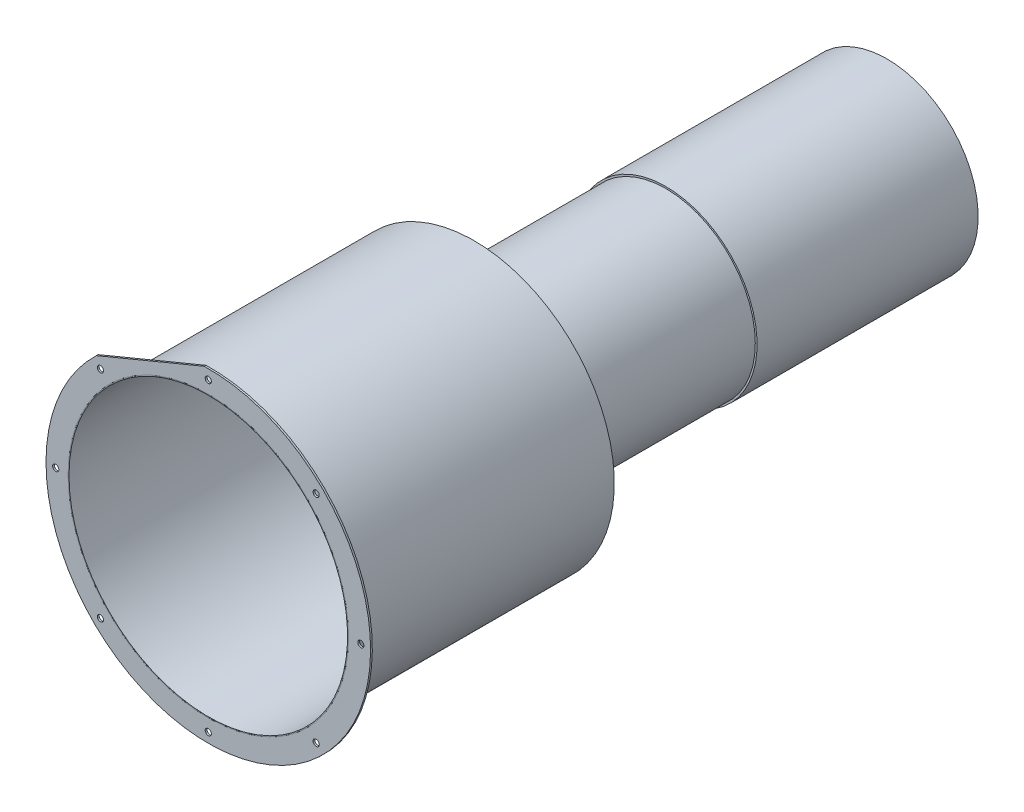
ISO-10303-21;
HEADER;
FILE_DESCRIPTION(('STEP AP214'),'2;1');
FILE_NAME('part.step','',(''),(''),'','','');
FILE_SCHEMA(('AUTOMOTIVE_DESIGN { 1 0 10303 214 1 1 1 1 }'));
ENDSEC;
DATA;
#1=APPLICATION_CONTEXT('core data for automotive mechanical design processes');
#2=APPLICATION_PROTOCOL_DEFINITION('international standard','automotive_design',2000,#1);
#3=PRODUCT_CONTEXT('',#1,'mechanical');
#4=PRODUCT('Part','Part','',(#3));
#5=PRODUCT_RELATED_PRODUCT_CATEGORY('part','',(#4));
#6=PRODUCT_DEFINITION_FORMATION('','',#4);
#7=PRODUCT_DEFINITION_CONTEXT('part definition',#1,'design');
#8=PRODUCT_DEFINITION('design','',#6,#7);
#9=PRODUCT_DEFINITION_SHAPE('','',#8);
#10=(LENGTH_UNIT() NAMED_UNIT(*) SI_UNIT(.MILLI.,.METRE.));
#11=(NAMED_UNIT(*) PLANE_ANGLE_UNIT() SI_UNIT($,.RADIAN.));
#12=(NAMED_UNIT(*) SI_UNIT($,.STERADIAN.) SOLID_ANGLE_UNIT());
#13=UNCERTAINTY_MEASURE_WITH_UNIT(LENGTH_MEASURE(1.E-05),#10,'distance_accuracy_value','');
#14=(GEOMETRIC_REPRESENTATION_CONTEXT(3) GLOBAL_UNCERTAINTY_ASSIGNED_CONTEXT((#13)) GLOBAL_UNIT_ASSIGNED_CONTEXT((#10,
#11,#12)) REPRESENTATION_CONTEXT('',''));
#15=CARTESIAN_POINT('',(0.,0.,0.));
#16=DIRECTION('',(0.,0.,1.));
#17=DIRECTION('',(1.,0.,0.));
#18=AXIS2_PLACEMENT_3D('',#15,#16,#17);
#19=CARTESIAN_POINT('',(0.,0.,765.5));
#20=DIRECTION('',(0.,0.,1.));
#21=DIRECTION('',(1.,0.,0.));
#22=AXIS2_PLACEMENT_3D('',#19,#20,#21);
#23=CYLINDRICAL_SURFACE('',#22,183.5);
#24=DIRECTION('',(0.,0.,-1.));
#25=VECTOR('',#24,1.);
#26=CARTESIAN_POINT('',(-4.53315254023774,183.443998342946,775.5));
#27=LINE('',#26,#25);
#28=CARTESIAN_POINT('',(-4.53315254023774,183.443998342946,767.5));
#29=VERTEX_POINT('',#28);
#30=CARTESIAN_POINT('',(-4.53315254023774,183.443998342946,765.5));
#31=VERTEX_POINT('',#30);
#32=EDGE_CURVE('E76',#29,#31,#27,.T.);
#33=ORIENTED_EDGE('',*,*,#32,.F.);
#34=CARTESIAN_POINT('',(0.,0.,767.5));
#35=DIRECTION('',(0.,0.,1.));
#36=DIRECTION('',(1.,0.,0.));
#37=AXIS2_PLACEMENT_3D('',#34,#35,#36);
#38=CIRCLE('',#37,183.5);
#39=CARTESIAN_POINT('',(-126.509072294917,132.919918097625,767.5));
#40=VERTEX_POINT('',#39);
#41=EDGE_CURVE('E89',#40,#29,#38,.T.);
#42=ORIENTED_EDGE('',*,*,#41,.F.);
#43=DIRECTION('',(0.,0.,-1.));
#44=VECTOR('',#43,1.);
#45=CARTESIAN_POINT('',(-126.509072294917,132.919918097625,775.5));
#46=LINE('',#45,#44);
#47=CARTESIAN_POINT('',(-126.509072294917,132.919918097625,765.5));
#48=VERTEX_POINT('',#47);
#49=EDGE_CURVE('E68',#40,#48,#46,.T.);
#50=ORIENTED_EDGE('',*,*,#49,.T.);
#51=CARTESIAN_POINT('',(0.,0.,765.5));
#52=DIRECTION('',(0.,0.,1.));
#53=DIRECTION('',(1.,0.,0.));
#54=AXIS2_PLACEMENT_3D('',#51,#52,#53);
#55=CIRCLE('',#54,183.5);
#56=EDGE_CURVE('E62',#48,#31,#55,.T.);
#57=ORIENTED_EDGE('',*,*,#56,.T.);
#58=EDGE_LOOP('',(#33,#42,#50,#57));
#59=FACE_BOUND('',#58,.T.);
#60=ADVANCED_FACE('F55',(#59),#23,.T.);
#61=CARTESIAN_POINT('',(0.,0.,765.5));
#62=DIRECTION('',(0.,0.,1.));
#63=DIRECTION('',(1.,0.,0.));
#64=AXIS2_PLACEMENT_3D('',#61,#62,#63);
#65=PLANE('',#64);
#66=CARTESIAN_POINT('',(121.975919754681,-121.975919754678,765.5));
#67=DIRECTION('',(0.,0.,1.));
#68=DIRECTION('',(0.707106781186556,-0.707106781186539,0.));
#69=AXIS2_PLACEMENT_3D('',#66,#67,#68);
#70=CIRCLE('',#69,3.49999999999999);
#71=CARTESIAN_POINT('',(124.450793488834,-124.450793488831,765.5));
#72=VERTEX_POINT('',#71);
#73=EDGE_CURVE('E138',#72,#72,#70,.T.);
#74=ORIENTED_EDGE('',*,*,#73,.T.);
#75=EDGE_LOOP('',(#74));
#76=FACE_BOUND('',#75,.T.);
#77=CARTESIAN_POINT('',(1.80684159285132E-12,-172.5,765.5));
#78=DIRECTION('',(0.,0.,1.));
#79=DIRECTION('',(0.,-1.,0.));
#80=AXIS2_PLACEMENT_3D('',#77,#78,#79);
#81=CIRCLE('',#80,3.49999999999999);
#82=CARTESIAN_POINT('',(1.84350214690917E-12,-176.,765.5));
#83=VERTEX_POINT('',#82);
#84=EDGE_CURVE('E132',#83,#83,#81,.T.);
#85=ORIENTED_EDGE('',*,*,#84,.T.);
#86=EDGE_LOOP('',(#85));
#87=FACE_BOUND('',#86,.T.);
#88=CARTESIAN_POINT('',(-121.975919754678,-121.975919754681,765.5));
#89=DIRECTION('',(0.,0.,1.));
#90=DIRECTION('',(-0.707106781186541,-0.707106781186554,0.));
#91=AXIS2_PLACEMENT_3D('',#88,#89,#90);
#92=CIRCLE('',#91,3.49999999999999);
#93=CARTESIAN_POINT('',(-124.450793488831,-124.450793488833,765.5));
#94=VERTEX_POINT('',#93);
#95=EDGE_CURVE('E126',#94,#94,#92,.T.);
#96=ORIENTED_EDGE('',*,*,#95,.T.);
#97=EDGE_LOOP('',(#96));
#98=FACE_BOUND('',#97,.T.);
#99=CARTESIAN_POINT('',(-172.5,0.,765.5));
#100=DIRECTION('',(0.,0.,1.));
#101=DIRECTION('',(-1.,0.,0.));
#102=AXIS2_PLACEMENT_3D('',#99,#100,#101);
#103=CIRCLE('',#102,3.49999999999999);
#104=CARTESIAN_POINT('',(-176.,0.,765.5));
#105=VERTEX_POINT('',#104);
#106=EDGE_CURVE('E120',#105,#105,#103,.T.);
#107=ORIENTED_EDGE('',*,*,#106,.T.);
#108=EDGE_LOOP('',(#107));
#109=FACE_BOUND('',#108,.T.);
#110=CARTESIAN_POINT('',(-121.97591975468,121.975919754679,765.5));
#111=DIRECTION('',(0.,0.,1.));
#112=DIRECTION('',(-0.707106781186551,0.707106781186544,0.));
#113=AXIS2_PLACEMENT_3D('',#110,#111,#112);
#114=CIRCLE('',#113,3.49999999999999);
#115=CARTESIAN_POINT('',(-124.450793488833,124.450793488832,765.5));
#116=VERTEX_POINT('',#115);
#117=EDGE_CURVE('E114',#116,#116,#114,.T.);
#118=ORIENTED_EDGE('',*,*,#117,.T.);
#119=EDGE_LOOP('',(#118));
#120=FACE_BOUND('',#119,.T.);
#121=CARTESIAN_POINT('',(-6.0228053095044E-13,172.5,765.5));
#122=DIRECTION('',(0.,0.,1.));
#123=DIRECTION('',(0.,1.,0.));
#124=AXIS2_PLACEMENT_3D('',#121,#122,#123);
#125=CIRCLE('',#124,3.49999999999999);
#126=CARTESIAN_POINT('',(-6.14500715636391E-13,176.,765.5));
#127=VERTEX_POINT('',#126);
#128=EDGE_CURVE('E108',#127,#127,#125,.T.);
#129=ORIENTED_EDGE('',*,*,#128,.T.);
#130=EDGE_LOOP('',(#129));
#131=FACE_BOUND('',#130,.T.);
#132=CARTESIAN_POINT('',(121.975919754679,121.97591975468,765.5));
#133=DIRECTION('',(0.,0.,1.));
#134=DIRECTION('',(0.707106781186546,0.707106781186549,0.));
#135=AXIS2_PLACEMENT_3D('',#132,#133,#134);
#136=CIRCLE('',#135,3.49999999999999);
#137=CARTESIAN_POINT('',(124.450793488832,124.450793488833,765.5));
#138=VERTEX_POINT('',#137);
#139=EDGE_CURVE('E102',#138,#138,#136,.T.);
#140=ORIENTED_EDGE('',*,*,#139,.T.);
#141=EDGE_LOOP('',(#140));
#142=FACE_BOUND('',#141,.T.);
#143=CARTESIAN_POINT('',(172.5,0.,765.5));
#144=DIRECTION('',(0.,0.,1.));
#145=DIRECTION('',(1.,0.,0.));
#146=AXIS2_PLACEMENT_3D('',#143,#144,#145);
#147=CIRCLE('',#146,3.49999999999999);
#148=CARTESIAN_POINT('',(176.,0.,765.5));
#149=VERTEX_POINT('',#148);
#150=EDGE_CURVE('E96',#149,#149,#147,.T.);
#151=ORIENTED_EDGE('',*,*,#150,.T.);
#152=EDGE_LOOP('',(#151));
#153=FACE_BOUND('',#152,.T.);
#154=CARTESIAN_POINT('',(0.,0.,765.5));
#155=DIRECTION('',(0.,0.,1.));
#156=DIRECTION('',(1.,0.,0.));
#157=AXIS2_PLACEMENT_3D('',#154,#155,#156);
#158=CIRCLE('',#157,158.5);
#159=CARTESIAN_POINT('',(158.5,0.,765.5));
#160=VERTEX_POINT('',#159);
#161=EDGE_CURVE('E91',#160,#160,#158,.T.);
#162=ORIENTED_EDGE('',*,*,#161,.T.);
#163=EDGE_LOOP('',(#162));
#164=FACE_BOUND('',#163,.T.);
#165=ORIENTED_EDGE('',*,*,#56,.F.);
#166=DIRECTION('',(-0.923879532511285,-0.382683432365094,0.));
#167=VECTOR('',#166,1.);
#168=CARTESIAN_POINT('',(-4.53315254023774,183.443998342946,765.5));
#169=LINE('',#168,#167);
#170=EDGE_CURVE('E79',#31,#48,#169,.T.);
#171=ORIENTED_EDGE('',*,*,#170,.F.);
#172=EDGE_LOOP('',(#165,#171));
#173=FACE_BOUND('',#172,.T.);
#174=ADVANCED_FACE('F87',(#76,#87,#98,#109,#120,#131,#142,#153,#164,#173),#65,.F.);
#175=CARTESIAN_POINT('',(0.,0.,767.5));
#176=DIRECTION('',(0.,0.,1.));
#177=DIRECTION('',(1.,0.,0.));
#178=AXIS2_PLACEMENT_3D('',#175,#176,#177);
#179=PLANE('',#178);
#180=DIRECTION('',(0.923879532511285,0.382683432365094,0.));
#181=VECTOR('',#180,1.);
#182=CARTESIAN_POINT('',(-65.5211124175775,158.181958220286,767.5));
#183=LINE('',#182,#181);
#184=EDGE_CURVE('E13',#40,#29,#183,.T.);
#185=ORIENTED_EDGE('',*,*,#184,.F.);
#186=ORIENTED_EDGE('',*,*,#41,.T.);
#187=EDGE_LOOP('',(#185,#186));
#188=FACE_BOUND('',#187,.T.);
#189=CARTESIAN_POINT('',(121.975919754681,-121.975919754678,767.5));
#190=DIRECTION('',(0.,0.,1.));
#191=DIRECTION('',(0.707106781186556,-0.707106781186539,0.));
#192=AXIS2_PLACEMENT_3D('',#189,#190,#191);
#193=CIRCLE('',#192,3.49999999999999);
#194=CARTESIAN_POINT('',(124.450793488834,-124.450793488831,767.5));
#195=VERTEX_POINT('',#194);
#196=EDGE_CURVE('E141',#195,#195,#193,.T.);
#197=ORIENTED_EDGE('',*,*,#196,.F.);
#198=EDGE_LOOP('',(#197));
#199=FACE_BOUND('',#198,.T.);
#200=CARTESIAN_POINT('',(1.80684159285132E-12,-172.5,767.5));
#201=DIRECTION('',(0.,0.,1.));
#202=DIRECTION('',(0.,-1.,0.));
#203=AXIS2_PLACEMENT_3D('',#200,#201,#202);
#204=CIRCLE('',#203,3.49999999999999);
#205=CARTESIAN_POINT('',(1.84350214690917E-12,-176.,767.5));
#206=VERTEX_POINT('',#205);
#207=EDGE_CURVE('E135',#206,#206,#204,.T.);
#208=ORIENTED_EDGE('',*,*,#207,.F.);
#209=EDGE_LOOP('',(#208));
#210=FACE_BOUND('',#209,.T.);
#211=CARTESIAN_POINT('',(-121.975919754678,-121.975919754681,767.5));
#212=DIRECTION('',(0.,0.,1.));
#213=DIRECTION('',(-0.707106781186541,-0.707106781186554,0.));
#214=AXIS2_PLACEMENT_3D('',#211,#212,#213);
#215=CIRCLE('',#214,3.49999999999999);
#216=CARTESIAN_POINT('',(-124.450793488831,-124.450793488833,767.5));
#217=VERTEX_POINT('',#216);
#218=EDGE_CURVE('E129',#217,#217,#215,.T.);
#219=ORIENTED_EDGE('',*,*,#218,.F.);
#220=EDGE_LOOP('',(#219));
#221=FACE_BOUND('',#220,.T.);
#222=CARTESIAN_POINT('',(-172.5,0.,767.5));
#223=DIRECTION('',(0.,0.,1.));
#224=DIRECTION('',(-1.,0.,0.));
#225=AXIS2_PLACEMENT_3D('',#222,#223,#224);
#226=CIRCLE('',#225,3.49999999999999);
#227=CARTESIAN_POINT('',(-176.,0.,767.5));
#228=VERTEX_POINT('',#227);
#229=EDGE_CURVE('E123',#228,#228,#226,.T.);
#230=ORIENTED_EDGE('',*,*,#229,.F.);
#231=EDGE_LOOP('',(#230));
#232=FACE_BOUND('',#231,.T.);
#233=CARTESIAN_POINT('',(-121.97591975468,121.975919754679,767.5));
#234=DIRECTION('',(0.,0.,1.));
#235=DIRECTION('',(-0.707106781186551,0.707106781186544,0.));
#236=AXIS2_PLACEMENT_3D('',#233,#234,#235);
#237=CIRCLE('',#236,3.49999999999999);
#238=CARTESIAN_POINT('',(-124.450793488833,124.450793488832,767.5));
#239=VERTEX_POINT('',#238);
#240=EDGE_CURVE('E117',#239,#239,#237,.T.);
#241=ORIENTED_EDGE('',*,*,#240,.F.);
#242=EDGE_LOOP('',(#241));
#243=FACE_BOUND('',#242,.T.);
#244=CARTESIAN_POINT('',(-6.0228053095044E-13,172.5,767.5));
#245=DIRECTION('',(0.,0.,1.));
#246=DIRECTION('',(0.,1.,0.));
#247=AXIS2_PLACEMENT_3D('',#244,#245,#246);
#248=CIRCLE('',#247,3.49999999999999);
#249=CARTESIAN_POINT('',(-6.14500715636391E-13,176.,767.5));
#250=VERTEX_POINT('',#249);
#251=EDGE_CURVE('E111',#250,#250,#248,.T.);
#252=ORIENTED_EDGE('',*,*,#251,.F.);
#253=EDGE_LOOP('',(#252));
#254=FACE_BOUND('',#253,.T.);
#255=CARTESIAN_POINT('',(121.975919754679,121.97591975468,767.5));
#256=DIRECTION('',(0.,0.,1.));
#257=DIRECTION('',(0.707106781186546,0.707106781186549,0.));
#258=AXIS2_PLACEMENT_3D('',#255,#256,#257);
#259=CIRCLE('',#258,3.49999999999999);
#260=CARTESIAN_POINT('',(124.450793488832,124.450793488833,767.5));
#261=VERTEX_POINT('',#260);
#262=EDGE_CURVE('E105',#261,#261,#259,.T.);
#263=ORIENTED_EDGE('',*,*,#262,.F.);
#264=EDGE_LOOP('',(#263));
#265=FACE_BOUND('',#264,.T.);
#266=CARTESIAN_POINT('',(172.5,0.,767.5));
#267=DIRECTION('',(0.,0.,1.));
#268=DIRECTION('',(1.,0.,0.));
#269=AXIS2_PLACEMENT_3D('',#266,#267,#268);
#270=CIRCLE('',#269,3.49999999999999);
#271=CARTESIAN_POINT('',(176.,0.,767.5));
#272=VERTEX_POINT('',#271);
#273=EDGE_CURVE('E99',#272,#272,#270,.T.);
#274=ORIENTED_EDGE('',*,*,#273,.F.);
#275=EDGE_LOOP('',(#274));
#276=FACE_BOUND('',#275,.T.);
#277=CARTESIAN_POINT('',(0.,0.,767.5));
#278=DIRECTION('',(0.,0.,1.));
#279=DIRECTION('',(1.,0.,0.));
#280=AXIS2_PLACEMENT_3D('',#277,#278,#279);
#281=CIRCLE('',#280,158.5);
#282=CARTESIAN_POINT('',(158.5,0.,767.5));
#283=VERTEX_POINT('',#282);
#284=EDGE_CURVE('E93',#283,#283,#281,.T.);
#285=ORIENTED_EDGE('',*,*,#284,.F.);
#286=EDGE_LOOP('',(#285));
#287=FACE_BOUND('',#286,.T.);
#288=ADVANCED_FACE('F157',(#188,#199,#210,#221,#232,#243,#254,#265,#276,#287),#179,.T.);
#289=CARTESIAN_POINT('',(0.,0.,765.5));
#290=DIRECTION('',(0.,0.,1.));
#291=DIRECTION('',(1.,0.,0.));
#292=AXIS2_PLACEMENT_3D('',#289,#290,#291);
#293=CYLINDRICAL_SURFACE('',#292,158.5);
#294=ORIENTED_EDGE('',*,*,#161,.F.);
#295=EDGE_LOOP('',(#294));
#296=FACE_BOUND('',#295,.T.);
#297=ORIENTED_EDGE('',*,*,#284,.T.);
#298=EDGE_LOOP('',(#297));
#299=FACE_BOUND('',#298,.T.);
#300=ADVANCED_FACE('F160',(#296,#299),#293,.F.);
#301=CARTESIAN_POINT('',(172.5,0.,765.5));
#302=DIRECTION('',(0.,0.,1.));
#303=DIRECTION('',(1.,0.,0.));
#304=AXIS2_PLACEMENT_3D('',#301,#302,#303);
#305=CYLINDRICAL_SURFACE('',#304,3.49999999999999);
#306=ORIENTED_EDGE('',*,*,#150,.F.);
#307=EDGE_LOOP('',(#306));
#308=FACE_BOUND('',#307,.T.);
#309=ORIENTED_EDGE('',*,*,#273,.T.);
#310=EDGE_LOOP('',(#309));
#311=FACE_BOUND('',#310,.T.);
#312=ADVANCED_FACE('F179',(#308,#311),#305,.F.);
#313=CARTESIAN_POINT('',(121.975919754679,121.97591975468,765.5));
#314=DIRECTION('',(0.,0.,1.));
#315=DIRECTION('',(1.,0.,0.));
#316=AXIS2_PLACEMENT_3D('',#313,#314,#315);
#317=CYLINDRICAL_SURFACE('',#316,3.49999999999999);
#318=ORIENTED_EDGE('',*,*,#139,.F.);
#319=EDGE_LOOP('',(#318));
#320=FACE_BOUND('',#319,.T.);
#321=ORIENTED_EDGE('',*,*,#262,.T.);
#322=EDGE_LOOP('',(#321));
#323=FACE_BOUND('',#322,.T.);
#324=ADVANCED_FACE('F186',(#320,#323),#317,.F.);
#325=CARTESIAN_POINT('',(-6.0228053095044E-13,172.5,765.5));
#326=DIRECTION('',(0.,0.,1.));
#327=DIRECTION('',(1.,0.,0.));
#328=AXIS2_PLACEMENT_3D('',#325,#326,#327);
#329=CYLINDRICAL_SURFACE('',#328,3.49999999999999);
#330=ORIENTED_EDGE('',*,*,#128,.F.);
#331=EDGE_LOOP('',(#330));
#332=FACE_BOUND('',#331,.T.);
#333=ORIENTED_EDGE('',*,*,#251,.T.);
#334=EDGE_LOOP('',(#333));
#335=FACE_BOUND('',#334,.T.);
#336=ADVANCED_FACE('F242',(#332,#335),#329,.F.);
#337=CARTESIAN_POINT('',(-121.97591975468,121.975919754679,765.5));
#338=DIRECTION('',(0.,0.,1.));
#339=DIRECTION('',(1.,0.,0.));
#340=AXIS2_PLACEMENT_3D('',#337,#338,#339);
#341=CYLINDRICAL_SURFACE('',#340,3.49999999999999);
#342=ORIENTED_EDGE('',*,*,#117,.F.);
#343=EDGE_LOOP('',(#342));
#344=FACE_BOUND('',#343,.T.);
#345=ORIENTED_EDGE('',*,*,#240,.T.);
#346=EDGE_LOOP('',(#345));
#347=FACE_BOUND('',#346,.T.);
#348=ADVANCED_FACE('F234',(#344,#347),#341,.F.);
#349=CARTESIAN_POINT('',(-172.5,0.,765.5));
#350=DIRECTION('',(0.,0.,1.));
#351=DIRECTION('',(1.,0.,0.));
#352=AXIS2_PLACEMENT_3D('',#349,#350,#351);
#353=CYLINDRICAL_SURFACE('',#352,3.49999999999999);
#354=ORIENTED_EDGE('',*,*,#106,.F.);
#355=EDGE_LOOP('',(#354));
#356=FACE_BOUND('',#355,.T.);
#357=ORIENTED_EDGE('',*,*,#229,.T.);
#358=EDGE_LOOP('',(#357));
#359=FACE_BOUND('',#358,.T.);
#360=ADVANCED_FACE('F226',(#356,#359),#353,.F.);
#361=CARTESIAN_POINT('',(-121.975919754678,-121.975919754681,765.5));
#362=DIRECTION('',(0.,0.,1.));
#363=DIRECTION('',(1.,0.,0.));
#364=AXIS2_PLACEMENT_3D('',#361,#362,#363);
#365=CYLINDRICAL_SURFACE('',#364,3.49999999999999);
#366=ORIENTED_EDGE('',*,*,#95,.F.);
#367=EDGE_LOOP('',(#366));
#368=FACE_BOUND('',#367,.T.);
#369=ORIENTED_EDGE('',*,*,#218,.T.);
#370=EDGE_LOOP('',(#369));
#371=FACE_BOUND('',#370,.T.);
#372=ADVANCED_FACE('F218',(#368,#371),#365,.F.);
#373=CARTESIAN_POINT('',(1.80684159285132E-12,-172.5,765.5));
#374=DIRECTION('',(0.,0.,1.));
#375=DIRECTION('',(1.,0.,0.));
#376=AXIS2_PLACEMENT_3D('',#373,#374,#375);
#377=CYLINDRICAL_SURFACE('',#376,3.49999999999999);
#378=ORIENTED_EDGE('',*,*,#84,.F.);
#379=EDGE_LOOP('',(#378));
#380=FACE_BOUND('',#379,.T.);
#381=ORIENTED_EDGE('',*,*,#207,.T.);
#382=EDGE_LOOP('',(#381));
#383=FACE_BOUND('',#382,.T.);
#384=ADVANCED_FACE('F153',(#380,#383),#377,.F.);
#385=CARTESIAN_POINT('',(121.975919754681,-121.975919754678,765.5));
#386=DIRECTION('',(0.,0.,1.));
#387=DIRECTION('',(1.,0.,0.));
#388=AXIS2_PLACEMENT_3D('',#385,#386,#387);
#389=CYLINDRICAL_SURFACE('',#388,3.49999999999999);
#390=ORIENTED_EDGE('',*,*,#73,.F.);
#391=EDGE_LOOP('',(#390));
#392=FACE_BOUND('',#391,.T.);
#393=ORIENTED_EDGE('',*,*,#196,.T.);
#394=EDGE_LOOP('',(#393));
#395=FACE_BOUND('',#394,.T.);
#396=ADVANCED_FACE('F150',(#392,#395),#389,.F.);
#397=CARTESIAN_POINT('',(-4.53315254023774,183.443998342946,775.5));
#398=DIRECTION('',(0.382683432365094,-0.923879532511285,0.));
#399=DIRECTION('',(0.923879532511285,0.382683432365094,0.));
#400=AXIS2_PLACEMENT_3D('',#397,#398,#399);
#401=PLANE('',#400);
#402=ORIENTED_EDGE('',*,*,#184,.T.);
#403=ORIENTED_EDGE('',*,*,#32,.T.);
#404=ORIENTED_EDGE('',*,*,#170,.T.);
#405=ORIENTED_EDGE('',*,*,#49,.F.);
#406=EDGE_LOOP('',(#402,#403,#404,#405));
#407=FACE_BOUND('',#406,.T.);
#408=ADVANCED_FACE('F78',(#407),#401,.F.);
#409=CLOSED_SHELL('',(#60,#174,#288,#300,#312,#324,#336,#348,#360,#372,#384,#396,#408));
#410=MANIFOLD_SOLID_BREP('B2',#409);
#411=CARTESIAN_POINT('',(0.,0.,0.));
#412=DIRECTION('',(0.,0.,-1.));
#413=DIRECTION('',(-1.,0.,0.));
#414=AXIS2_PLACEMENT_3D('',#411,#412,#413);
#415=CYLINDRICAL_SURFACE('',#414,101.);
#416=CARTESIAN_POINT('',(0.,0.,433.725009252407));
#417=DIRECTION('',(0.,0.,-1.));
#418=DIRECTION('',(-1.,0.,0.));
#419=AXIS2_PLACEMENT_3D('',#416,#417,#418);
#420=CIRCLE('',#419,101.);
#421=CARTESIAN_POINT('',(-101.,0.,433.725009252407));
#422=VERTEX_POINT('',#421);
#423=EDGE_CURVE('E347',#422,#422,#420,.T.);
#424=ORIENTED_EDGE('',*,*,#423,.T.);
#425=EDGE_LOOP('',(#424));
#426=FACE_BOUND('',#425,.T.);
#427=CARTESIAN_POINT('',(0.,0.,250.));
#428=DIRECTION('',(0.,0.,-1.));
#429=DIRECTION('',(-1.,0.,0.));
#430=AXIS2_PLACEMENT_3D('',#427,#428,#429);
#431=CIRCLE('',#430,101.);
#432=CARTESIAN_POINT('',(-101.,0.,250.));
#433=VERTEX_POINT('',#432);
#434=EDGE_CURVE('E54',#433,#433,#431,.T.);
#435=ORIENTED_EDGE('',*,*,#434,.F.);
#436=EDGE_LOOP('',(#435));
#437=FACE_BOUND('',#436,.T.);
#438=ADVANCED_FACE('F321',(#426,#437),#415,.T.);
#439=CARTESIAN_POINT('',(0.,0.,0.));
#440=DIRECTION('',(0.,0.,-1.));
#441=DIRECTION('',(-1.,0.,0.));
#442=AXIS2_PLACEMENT_3D('',#439,#440,#441);
#443=CYLINDRICAL_SURFACE('',#442,99.9999999999999);
#444=CARTESIAN_POINT('',(0.,0.,0.));
#445=DIRECTION('',(0.,0.,-1.));
#446=DIRECTION('',(-1.,0.,0.));
#447=AXIS2_PLACEMENT_3D('',#444,#445,#446);
#448=CIRCLE('',#447,99.9999999999999);
#449=CARTESIAN_POINT('',(-100.,0.,0.));
#450=VERTEX_POINT('',#449);
#451=EDGE_CURVE('E350',#450,#450,#448,.T.);
#452=ORIENTED_EDGE('',*,*,#451,.T.);
#453=EDGE_LOOP('',(#452));
#454=FACE_BOUND('',#453,.T.);
#455=CARTESIAN_POINT('',(0.,0.,434.302359521597));
#456=DIRECTION('',(0.,0.,-1.));
#457=DIRECTION('',(-1.,0.,0.));
#458=AXIS2_PLACEMENT_3D('',#455,#456,#457);
#459=CIRCLE('',#458,99.9999999999999);
#460=CARTESIAN_POINT('',(-100.,0.,434.302359521597));
#461=VERTEX_POINT('',#460);
#462=EDGE_CURVE('E328',#461,#461,#459,.T.);
#463=ORIENTED_EDGE('',*,*,#462,.F.);
#464=EDGE_LOOP('',(#463));
#465=FACE_BOUND('',#464,.T.);
#466=ADVANCED_FACE('F323',(#454,#465),#443,.F.);
#467=CARTESIAN_POINT('',(0.,0.,467.5));
#468=DIRECTION('',(0.,0.,1.));
#469=DIRECTION('',(1.,0.,0.));
#470=AXIS2_PLACEMENT_3D('',#467,#468,#469);
#471=CONICAL_SURFACE('',#470,157.5,1.0471975511966);
#472=ORIENTED_EDGE('',*,*,#462,.T.);
#473=EDGE_LOOP('',(#472));
#474=FACE_BOUND('',#473,.T.);
#475=CARTESIAN_POINT('',(0.,0.,467.5));
#476=DIRECTION('',(0.,0.,-1.));
#477=DIRECTION('',(-1.,0.,0.));
#478=AXIS2_PLACEMENT_3D('',#475,#476,#477);
#479=CIRCLE('',#478,157.5);
#480=CARTESIAN_POINT('',(-157.5,0.,467.5));
#481=VERTEX_POINT('',#480);
#482=EDGE_CURVE('E332',#481,#481,#479,.T.);
#483=ORIENTED_EDGE('',*,*,#482,.F.);
#484=EDGE_LOOP('',(#483));
#485=FACE_BOUND('',#484,.T.);
#486=ADVANCED_FACE('F377',(#474,#485),#471,.F.);
#487=CARTESIAN_POINT('',(0.,0.,0.));
#488=DIRECTION('',(0.,0.,-1.));
#489=DIRECTION('',(-1.,0.,0.));
#490=AXIS2_PLACEMENT_3D('',#487,#488,#489);
#491=CYLINDRICAL_SURFACE('',#490,157.5);
#492=ORIENTED_EDGE('',*,*,#482,.T.);
#493=EDGE_LOOP('',(#492));
#494=FACE_BOUND('',#493,.T.);
#495=CARTESIAN_POINT('',(0.,0.,767.5));
#496=DIRECTION('',(0.,0.,-1.));
#497=DIRECTION('',(-1.,0.,0.));
#498=AXIS2_PLACEMENT_3D('',#495,#496,#497);
#499=CIRCLE('',#498,157.5);
#500=CARTESIAN_POINT('',(-157.5,0.,767.5));
#501=VERTEX_POINT('',#500);
#502=EDGE_CURVE('E336',#501,#501,#499,.T.);
#503=ORIENTED_EDGE('',*,*,#502,.F.);
#504=EDGE_LOOP('',(#503));
#505=FACE_BOUND('',#504,.T.);
#506=ADVANCED_FACE('F393',(#494,#505),#491,.F.);
#507=CARTESIAN_POINT('',(0.,157.5,767.5));
#508=DIRECTION('',(0.,0.,-1.));
#509=DIRECTION('',(-1.,0.,0.));
#510=AXIS2_PLACEMENT_3D('',#507,#508,#509);
#511=PLANE('',#510);
#512=CARTESIAN_POINT('',(0.,0.,767.5));
#513=DIRECTION('',(0.,0.,-1.));
#514=DIRECTION('',(-1.,0.,0.));
#515=AXIS2_PLACEMENT_3D('',#512,#513,#514);
#516=CIRCLE('',#515,158.5);
#517=CARTESIAN_POINT('',(-158.5,0.,767.5));
#518=VERTEX_POINT('',#517);
#519=EDGE_CURVE('E341',#518,#518,#516,.T.);
#520=ORIENTED_EDGE('',*,*,#519,.F.);
#521=EDGE_LOOP('',(#520));
#522=FACE_BOUND('',#521,.T.);
#523=ORIENTED_EDGE('',*,*,#502,.T.);
#524=EDGE_LOOP('',(#523));
#525=FACE_BOUND('',#524,.T.);
#526=ADVANCED_FACE('F389',(#522,#525),#511,.F.);
#527=CARTESIAN_POINT('',(0.,0.,0.));
#528=DIRECTION('',(0.,0.,-1.));
#529=DIRECTION('',(-1.,0.,0.));
#530=AXIS2_PLACEMENT_3D('',#527,#528,#529);
#531=CYLINDRICAL_SURFACE('',#530,158.5);
#532=CARTESIAN_POINT('',(0.,0.,466.92264973081));
#533=DIRECTION('',(0.,0.,-1.));
#534=DIRECTION('',(-1.,0.,0.));
#535=AXIS2_PLACEMENT_3D('',#532,#533,#534);
#536=CIRCLE('',#535,158.5);
#537=CARTESIAN_POINT('',(-158.5,0.,466.92264973081));
#538=VERTEX_POINT('',#537);
#539=EDGE_CURVE('E344',#538,#538,#536,.T.);
#540=ORIENTED_EDGE('',*,*,#539,.F.);
#541=EDGE_LOOP('',(#540));
#542=FACE_BOUND('',#541,.T.);
#543=ORIENTED_EDGE('',*,*,#519,.T.);
#544=EDGE_LOOP('',(#543));
#545=FACE_BOUND('',#544,.T.);
#546=ADVANCED_FACE('F385',(#542,#545),#531,.T.);
#547=CARTESIAN_POINT('',(0.,0.,466.92264973081));
#548=DIRECTION('',(0.,0.,1.));
#549=DIRECTION('',(1.,0.,0.));
#550=AXIS2_PLACEMENT_3D('',#547,#548,#549);
#551=CONICAL_SURFACE('',#550,158.5,1.0471975511966);
#552=ORIENTED_EDGE('',*,*,#423,.F.);
#553=EDGE_LOOP('',(#552));
#554=FACE_BOUND('',#553,.T.);
#555=ORIENTED_EDGE('',*,*,#539,.T.);
#556=EDGE_LOOP('',(#555));
#557=FACE_BOUND('',#556,.T.);
#558=ADVANCED_FACE('F382',(#554,#557),#551,.T.);
#559=CARTESIAN_POINT('',(0.,101.,0.));
#560=DIRECTION('',(0.,0.,1.));
#561=DIRECTION('',(1.,0.,0.));
#562=AXIS2_PLACEMENT_3D('',#559,#560,#561);
#563=PLANE('',#562);
#564=ORIENTED_EDGE('',*,*,#451,.F.);
#565=EDGE_LOOP('',(#564));
#566=FACE_BOUND('',#565,.T.);
#567=CARTESIAN_POINT('',(0.,0.,0.));
#568=DIRECTION('',(0.,0.,-1.));
#569=DIRECTION('',(-1.,0.,0.));
#570=AXIS2_PLACEMENT_3D('',#567,#568,#569);
#571=CIRCLE('',#570,103.);
#572=CARTESIAN_POINT('',(-103.,0.,0.));
#573=VERTEX_POINT('',#572);
#574=EDGE_CURVE('E354',#573,#573,#571,.T.);
#575=ORIENTED_EDGE('',*,*,#574,.T.);
#576=EDGE_LOOP('',(#575));
#577=FACE_BOUND('',#576,.T.);
#578=ADVANCED_FACE('F369',(#566,#577),#563,.F.);
#579=CARTESIAN_POINT('',(0.,0.,250.));
#580=DIRECTION('',(0.,0.,-1.));
#581=DIRECTION('',(-1.,0.,0.));
#582=AXIS2_PLACEMENT_3D('',#579,#580,#581);
#583=CYLINDRICAL_SURFACE('',#582,103.);
#584=CARTESIAN_POINT('',(0.,0.,250.));
#585=DIRECTION('',(0.,0.,-1.));
#586=DIRECTION('',(-1.,0.,0.));
#587=AXIS2_PLACEMENT_3D('',#584,#585,#586);
#588=CIRCLE('',#587,103.);
#589=CARTESIAN_POINT('',(-103.,0.,250.));
#590=VERTEX_POINT('',#589);
#591=EDGE_CURVE('E353',#590,#590,#588,.T.);
#592=ORIENTED_EDGE('',*,*,#591,.T.);
#593=EDGE_LOOP('',(#592));
#594=FACE_BOUND('',#593,.T.);
#595=ORIENTED_EDGE('',*,*,#574,.F.);
#596=EDGE_LOOP('',(#595));
#597=FACE_BOUND('',#596,.T.);
#598=ADVANCED_FACE('F360',(#594,#597),#583,.T.);
#599=CARTESIAN_POINT('',(0.,0.,250.));
#600=DIRECTION('',(0.,0.,-1.));
#601=DIRECTION('',(-1.,0.,0.));
#602=AXIS2_PLACEMENT_3D('',#599,#600,#601);
#603=PLANE('',#602);
#604=ORIENTED_EDGE('',*,*,#434,.T.);
#605=EDGE_LOOP('',(#604));
#606=FACE_BOUND('',#605,.T.);
#607=ORIENTED_EDGE('',*,*,#591,.F.);
#608=EDGE_LOOP('',(#607));
#609=FACE_BOUND('',#608,.T.);
#610=ADVANCED_FACE('F363',(#606,#609),#603,.F.);
#611=CLOSED_SHELL('',(#438,#466,#486,#506,#526,#546,#558,#578,#598,#610));
#612=MANIFOLD_SOLID_BREP('B7',#611);
#613=ADVANCED_BREP_SHAPE_REPRESENTATION('',(#18,#410,#612),#14);
#614=SHAPE_DEFINITION_REPRESENTATION(#9,#613);
ENDSEC;
END-ISO-10303-21;
